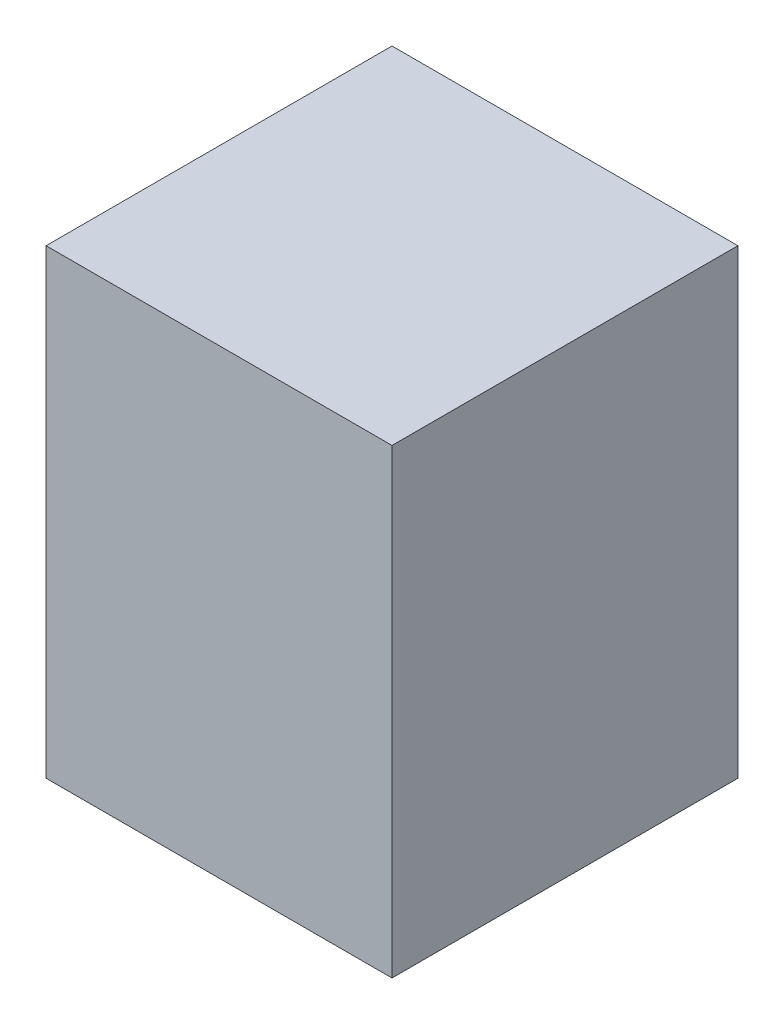
ISO-10303-21;
HEADER;
FILE_DESCRIPTION(('STEP AP214'),'2;1');
FILE_NAME('part.step','',(''),(''),'','','');
FILE_SCHEMA(('AUTOMOTIVE_DESIGN { 1 0 10303 214 1 1 1 1 }'));
ENDSEC;
DATA;
#1=APPLICATION_CONTEXT('core data for automotive mechanical design processes');
#2=APPLICATION_PROTOCOL_DEFINITION('international standard','automotive_design',2000,#1);
#3=PRODUCT_CONTEXT('',#1,'mechanical');
#4=PRODUCT('Part','Part','',(#3));
#5=PRODUCT_RELATED_PRODUCT_CATEGORY('part','',(#4));
#6=PRODUCT_DEFINITION_FORMATION('','',#4);
#7=PRODUCT_DEFINITION_CONTEXT('part definition',#1,'design');
#8=PRODUCT_DEFINITION('design','',#6,#7);
#9=PRODUCT_DEFINITION_SHAPE('','',#8);
#10=(LENGTH_UNIT() NAMED_UNIT(*) SI_UNIT(.MILLI.,.METRE.));
#11=(NAMED_UNIT(*) PLANE_ANGLE_UNIT() SI_UNIT($,.RADIAN.));
#12=(NAMED_UNIT(*) SI_UNIT($,.STERADIAN.) SOLID_ANGLE_UNIT());
#13=UNCERTAINTY_MEASURE_WITH_UNIT(LENGTH_MEASURE(1.E-05),#10,'distance_accuracy_value','');
#14=(GEOMETRIC_REPRESENTATION_CONTEXT(3) GLOBAL_UNCERTAINTY_ASSIGNED_CONTEXT((#13)) GLOBAL_UNIT_ASSIGNED_CONTEXT((#10,
#11,#12)) REPRESENTATION_CONTEXT('',''));
#15=CARTESIAN_POINT('',(0.,0.,0.));
#16=DIRECTION('',(0.,0.,1.));
#17=DIRECTION('',(1.,0.,0.));
#18=AXIS2_PLACEMENT_3D('',#15,#16,#17);
#19=CARTESIAN_POINT('',(0.,8.,0.));
#20=DIRECTION('',(1.,0.,0.));
#21=DIRECTION('',(0.,0.,-1.));
#22=AXIS2_PLACEMENT_3D('',#19,#20,#21);
#23=PLANE('',#22);
#24=DIRECTION('',(0.,0.,1.));
#25=VECTOR('',#24,1.);
#26=CARTESIAN_POINT('',(0.,0.,0.));
#27=LINE('',#26,#25);
#28=CARTESIAN_POINT('',(0.,0.,0.));
#29=VERTEX_POINT('',#28);
#30=CARTESIAN_POINT('',(0.,0.,6.));
#31=VERTEX_POINT('',#30);
#32=EDGE_CURVE('E107',#29,#31,#27,.T.);
#33=ORIENTED_EDGE('',*,*,#32,.T.);
#34=DIRECTION('',(0.,-1.,0.));
#35=VECTOR('',#34,1.);
#36=CARTESIAN_POINT('',(0.,8.,6.));
#37=LINE('',#36,#35);
#38=CARTESIAN_POINT('',(0.,8.,6.));
#39=VERTEX_POINT('',#38);
#40=EDGE_CURVE('E11',#39,#31,#37,.T.);
#41=ORIENTED_EDGE('',*,*,#40,.F.);
#42=DIRECTION('',(0.,0.,1.));
#43=VECTOR('',#42,1.);
#44=CARTESIAN_POINT('',(0.,8.,0.));
#45=LINE('',#44,#43);
#46=CARTESIAN_POINT('',(0.,8.,0.));
#47=VERTEX_POINT('',#46);
#48=EDGE_CURVE('E91',#47,#39,#45,.T.);
#49=ORIENTED_EDGE('',*,*,#48,.F.);
#50=DIRECTION('',(0.,-1.,0.));
#51=VECTOR('',#50,1.);
#52=CARTESIAN_POINT('',(0.,8.,0.));
#53=LINE('',#52,#51);
#54=EDGE_CURVE('E103',#47,#29,#53,.T.);
#55=ORIENTED_EDGE('',*,*,#54,.T.);
#56=EDGE_LOOP('',(#33,#41,#49,#55));
#57=FACE_BOUND('',#56,.T.);
#58=ADVANCED_FACE('F39',(#57),#23,.F.);
#59=CARTESIAN_POINT('',(0.,8.,6.));
#60=DIRECTION('',(0.,0.,-1.));
#61=DIRECTION('',(-1.,0.,0.));
#62=AXIS2_PLACEMENT_3D('',#59,#60,#61);
#63=PLANE('',#62);
#64=DIRECTION('',(1.,0.,0.));
#65=VECTOR('',#64,1.);
#66=CARTESIAN_POINT('',(0.,0.,6.));
#67=LINE('',#66,#65);
#68=CARTESIAN_POINT('',(6.,0.,6.));
#69=VERTEX_POINT('',#68);
#70=EDGE_CURVE('E96',#31,#69,#67,.T.);
#71=ORIENTED_EDGE('',*,*,#70,.T.);
#72=DIRECTION('',(0.,-1.,0.));
#73=VECTOR('',#72,1.);
#74=CARTESIAN_POINT('',(6.,8.,6.));
#75=LINE('',#74,#73);
#76=CARTESIAN_POINT('',(6.,8.,6.));
#77=VERTEX_POINT('',#76);
#78=EDGE_CURVE('E48',#77,#69,#75,.T.);
#79=ORIENTED_EDGE('',*,*,#78,.F.);
#80=DIRECTION('',(1.,0.,0.));
#81=VECTOR('',#80,1.);
#82=CARTESIAN_POINT('',(0.,8.,6.));
#83=LINE('',#82,#81);
#84=EDGE_CURVE('E86',#39,#77,#83,.T.);
#85=ORIENTED_EDGE('',*,*,#84,.F.);
#86=ORIENTED_EDGE('',*,*,#40,.T.);
#87=EDGE_LOOP('',(#71,#79,#85,#86));
#88=FACE_BOUND('',#87,.T.);
#89=ADVANCED_FACE('F95',(#88),#63,.F.);
#90=CARTESIAN_POINT('',(6.,8.,0.));
#91=DIRECTION('',(-1.,0.,0.));
#92=DIRECTION('',(0.,0.,1.));
#93=AXIS2_PLACEMENT_3D('',#90,#91,#92);
#94=PLANE('',#93);
#95=DIRECTION('',(0.,0.,-1.));
#96=VECTOR('',#95,1.);
#97=CARTESIAN_POINT('',(6.,0.,0.));
#98=LINE('',#97,#96);
#99=CARTESIAN_POINT('',(6.,0.,0.));
#100=VERTEX_POINT('',#99);
#101=EDGE_CURVE('E73',#69,#100,#98,.T.);
#102=ORIENTED_EDGE('',*,*,#101,.T.);
#103=DIRECTION('',(0.,-1.,0.));
#104=VECTOR('',#103,1.);
#105=CARTESIAN_POINT('',(6.,8.,0.));
#106=LINE('',#105,#104);
#107=CARTESIAN_POINT('',(6.,8.,0.));
#108=VERTEX_POINT('',#107);
#109=EDGE_CURVE('E98',#108,#100,#106,.T.);
#110=ORIENTED_EDGE('',*,*,#109,.F.);
#111=DIRECTION('',(0.,0.,-1.));
#112=VECTOR('',#111,1.);
#113=CARTESIAN_POINT('',(6.,8.,0.));
#114=LINE('',#113,#112);
#115=EDGE_CURVE('E89',#77,#108,#114,.T.);
#116=ORIENTED_EDGE('',*,*,#115,.F.);
#117=ORIENTED_EDGE('',*,*,#78,.T.);
#118=EDGE_LOOP('',(#102,#110,#116,#117));
#119=FACE_BOUND('',#118,.T.);
#120=ADVANCED_FACE('F99',(#119),#94,.F.);
#121=CARTESIAN_POINT('',(0.,8.,0.));
#122=DIRECTION('',(0.,0.,1.));
#123=DIRECTION('',(1.,0.,0.));
#124=AXIS2_PLACEMENT_3D('',#121,#122,#123);
#125=PLANE('',#124);
#126=DIRECTION('',(-1.,0.,0.));
#127=VECTOR('',#126,1.);
#128=CARTESIAN_POINT('',(0.,0.,0.));
#129=LINE('',#128,#127);
#130=EDGE_CURVE('E79',#100,#29,#129,.T.);
#131=ORIENTED_EDGE('',*,*,#130,.T.);
#132=ORIENTED_EDGE('',*,*,#54,.F.);
#133=DIRECTION('',(-1.,0.,0.));
#134=VECTOR('',#133,1.);
#135=CARTESIAN_POINT('',(0.,8.,0.));
#136=LINE('',#135,#134);
#137=EDGE_CURVE('E56',#108,#47,#136,.T.);
#138=ORIENTED_EDGE('',*,*,#137,.F.);
#139=ORIENTED_EDGE('',*,*,#109,.T.);
#140=EDGE_LOOP('',(#131,#132,#138,#139));
#141=FACE_BOUND('',#140,.T.);
#142=ADVANCED_FACE('F120',(#141),#125,.F.);
#143=CARTESIAN_POINT('',(0.,8.,0.));
#144=DIRECTION('',(0.,1.,0.));
#145=DIRECTION('',(0.,0.,1.));
#146=AXIS2_PLACEMENT_3D('',#143,#144,#145);
#147=PLANE('',#146);
#148=ORIENTED_EDGE('',*,*,#48,.T.);
#149=ORIENTED_EDGE('',*,*,#84,.T.);
#150=ORIENTED_EDGE('',*,*,#115,.T.);
#151=ORIENTED_EDGE('',*,*,#137,.T.);
#152=EDGE_LOOP('',(#148,#149,#150,#151));
#153=FACE_BOUND('',#152,.T.);
#154=ADVANCED_FACE('F87',(#153),#147,.T.);
#155=CARTESIAN_POINT('',(0.,0.,0.));
#156=DIRECTION('',(0.,1.,0.));
#157=DIRECTION('',(0.,0.,1.));
#158=AXIS2_PLACEMENT_3D('',#155,#156,#157);
#159=PLANE('',#158);
#160=ORIENTED_EDGE('',*,*,#32,.F.);
#161=ORIENTED_EDGE('',*,*,#130,.F.);
#162=ORIENTED_EDGE('',*,*,#101,.F.);
#163=ORIENTED_EDGE('',*,*,#70,.F.);
#164=EDGE_LOOP('',(#160,#161,#162,#163));
#165=FACE_BOUND('',#164,.T.);
#166=ADVANCED_FACE('F123',(#165),#159,.F.);
#167=CLOSED_SHELL('',(#58,#89,#120,#142,#154,#166));
#168=MANIFOLD_SOLID_BREP('B2',#167);
#169=ADVANCED_BREP_SHAPE_REPRESENTATION('',(#18,#168),#14);
#170=SHAPE_DEFINITION_REPRESENTATION(#9,#169);
ENDSEC;
END-ISO-10303-21;
